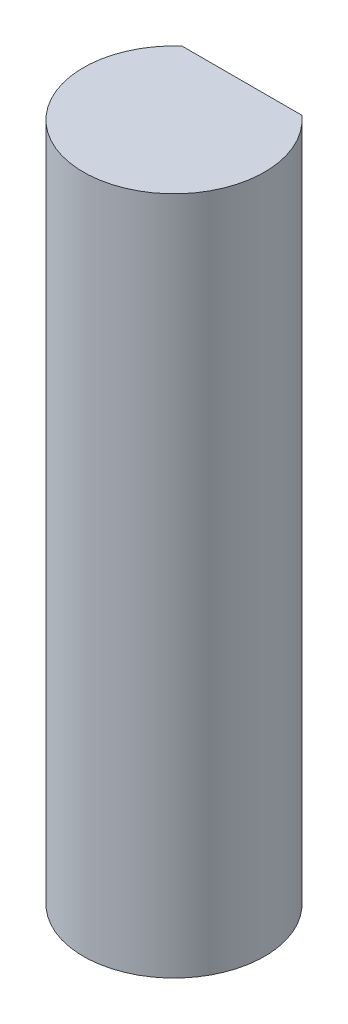
ISO-10303-21;
HEADER;
FILE_DESCRIPTION(('STEP AP214'),'2;1');
FILE_NAME('part.step','',(''),(''),'','','');
FILE_SCHEMA(('AUTOMOTIVE_DESIGN { 1 0 10303 214 1 1 1 1 }'));
ENDSEC;
DATA;
#1=APPLICATION_CONTEXT('core data for automotive mechanical design processes');
#2=APPLICATION_PROTOCOL_DEFINITION('international standard','automotive_design',2000,#1);
#3=PRODUCT_CONTEXT('',#1,'mechanical');
#4=PRODUCT('Part','Part','',(#3));
#5=PRODUCT_RELATED_PRODUCT_CATEGORY('part','',(#4));
#6=PRODUCT_DEFINITION_FORMATION('','',#4);
#7=PRODUCT_DEFINITION_CONTEXT('part definition',#1,'design');
#8=PRODUCT_DEFINITION('design','',#6,#7);
#9=PRODUCT_DEFINITION_SHAPE('','',#8);
#10=(LENGTH_UNIT() NAMED_UNIT(*) SI_UNIT(.MILLI.,.METRE.));
#11=(NAMED_UNIT(*) PLANE_ANGLE_UNIT() SI_UNIT($,.RADIAN.));
#12=(NAMED_UNIT(*) SI_UNIT($,.STERADIAN.) SOLID_ANGLE_UNIT());
#13=UNCERTAINTY_MEASURE_WITH_UNIT(LENGTH_MEASURE(1.E-05),#10,'distance_accuracy_value','');
#14=(GEOMETRIC_REPRESENTATION_CONTEXT(3) GLOBAL_UNCERTAINTY_ASSIGNED_CONTEXT((#13)) GLOBAL_UNIT_ASSIGNED_CONTEXT((#10,
#11,#12)) REPRESENTATION_CONTEXT('',''));
#15=CARTESIAN_POINT('',(0.,0.,0.));
#16=DIRECTION('',(0.,0.,1.));
#17=DIRECTION('',(1.,0.,0.));
#18=AXIS2_PLACEMENT_3D('',#15,#16,#17);
#19=CARTESIAN_POINT('',(0.,15.,0.));
#20=DIRECTION('',(0.,-1.,0.));
#21=DIRECTION('',(0.,0.,-1.));
#22=AXIS2_PLACEMENT_3D('',#19,#20,#21);
#23=CYLINDRICAL_SURFACE('',#22,2.);
#24=CARTESIAN_POINT('',(0.,0.,0.));
#25=DIRECTION('',(0.,1.,0.));
#26=DIRECTION('',(0.,0.,1.));
#27=AXIS2_PLACEMENT_3D('',#24,#25,#26);
#28=CIRCLE('',#27,2.);
#29=CARTESIAN_POINT('',(-1.3228756555323,0.,-1.5));
#30=VERTEX_POINT('',#29);
#31=CARTESIAN_POINT('',(1.3228756555323,0.,-1.5));
#32=VERTEX_POINT('',#31);
#33=EDGE_CURVE('E71',#30,#32,#28,.T.);
#34=ORIENTED_EDGE('',*,*,#33,.T.);
#35=DIRECTION('',(0.,-1.,0.));
#36=VECTOR('',#35,1.);
#37=CARTESIAN_POINT('',(1.3228756555323,15.,-1.5));
#38=LINE('',#37,#36);
#39=CARTESIAN_POINT('',(1.3228756555323,15.,-1.5));
#40=VERTEX_POINT('',#39);
#41=EDGE_CURVE('E11',#40,#32,#38,.T.);
#42=ORIENTED_EDGE('',*,*,#41,.F.);
#43=CARTESIAN_POINT('',(0.,15.,0.));
#44=DIRECTION('',(0.,1.,0.));
#45=DIRECTION('',(0.,0.,1.));
#46=AXIS2_PLACEMENT_3D('',#43,#44,#45);
#47=CIRCLE('',#46,2.);
#48=CARTESIAN_POINT('',(-1.3228756555323,15.,-1.5));
#49=VERTEX_POINT('',#48);
#50=EDGE_CURVE('E70',#49,#40,#47,.T.);
#51=ORIENTED_EDGE('',*,*,#50,.F.);
#52=DIRECTION('',(0.,-1.,0.));
#53=VECTOR('',#52,1.);
#54=CARTESIAN_POINT('',(-1.3228756555323,15.,-1.5));
#55=LINE('',#54,#53);
#56=EDGE_CURVE('E47',#49,#30,#55,.T.);
#57=ORIENTED_EDGE('',*,*,#56,.T.);
#58=EDGE_LOOP('',(#34,#42,#51,#57));
#59=FACE_BOUND('',#58,.T.);
#60=ADVANCED_FACE('F38',(#59),#23,.T.);
#61=CARTESIAN_POINT('',(1.3228756555323,15.,-1.5));
#62=DIRECTION('',(0.,0.,1.));
#63=DIRECTION('',(1.,0.,0.));
#64=AXIS2_PLACEMENT_3D('',#61,#62,#63);
#65=PLANE('',#64);
#66=DIRECTION('',(-1.,0.,0.));
#67=VECTOR('',#66,1.);
#68=CARTESIAN_POINT('',(1.3228756555323,0.,-1.5));
#69=LINE('',#68,#67);
#70=EDGE_CURVE('E62',#32,#30,#69,.T.);
#71=ORIENTED_EDGE('',*,*,#70,.T.);
#72=ORIENTED_EDGE('',*,*,#56,.F.);
#73=DIRECTION('',(-1.,0.,0.));
#74=VECTOR('',#73,1.);
#75=CARTESIAN_POINT('',(1.3228756555323,15.,-1.5));
#76=LINE('',#75,#74);
#77=EDGE_CURVE('E54',#40,#49,#76,.T.);
#78=ORIENTED_EDGE('',*,*,#77,.F.);
#79=ORIENTED_EDGE('',*,*,#41,.T.);
#80=EDGE_LOOP('',(#71,#72,#78,#79));
#81=FACE_BOUND('',#80,.T.);
#82=ADVANCED_FACE('F65',(#81),#65,.F.);
#83=CARTESIAN_POINT('',(0.,15.,0.));
#84=DIRECTION('',(0.,1.,0.));
#85=DIRECTION('',(0.,0.,1.));
#86=AXIS2_PLACEMENT_3D('',#83,#84,#85);
#87=PLANE('',#86);
#88=ORIENTED_EDGE('',*,*,#50,.T.);
#89=ORIENTED_EDGE('',*,*,#77,.T.);
#90=EDGE_LOOP('',(#88,#89));
#91=FACE_BOUND('',#90,.T.);
#92=ADVANCED_FACE('F82',(#91),#87,.T.);
#93=CARTESIAN_POINT('',(0.,0.,0.));
#94=DIRECTION('',(0.,1.,0.));
#95=DIRECTION('',(0.,0.,1.));
#96=AXIS2_PLACEMENT_3D('',#93,#94,#95);
#97=PLANE('',#96);
#98=ORIENTED_EDGE('',*,*,#33,.F.);
#99=ORIENTED_EDGE('',*,*,#70,.F.);
#100=EDGE_LOOP('',(#98,#99));
#101=FACE_BOUND('',#100,.T.);
#102=ADVANCED_FACE('F75',(#101),#97,.F.);
#103=CLOSED_SHELL('',(#60,#82,#92,#102));
#104=MANIFOLD_SOLID_BREP('B2',#103);
#105=ADVANCED_BREP_SHAPE_REPRESENTATION('',(#18,#104),#14);
#106=SHAPE_DEFINITION_REPRESENTATION(#9,#105);
ENDSEC;
END-ISO-10303-21;
